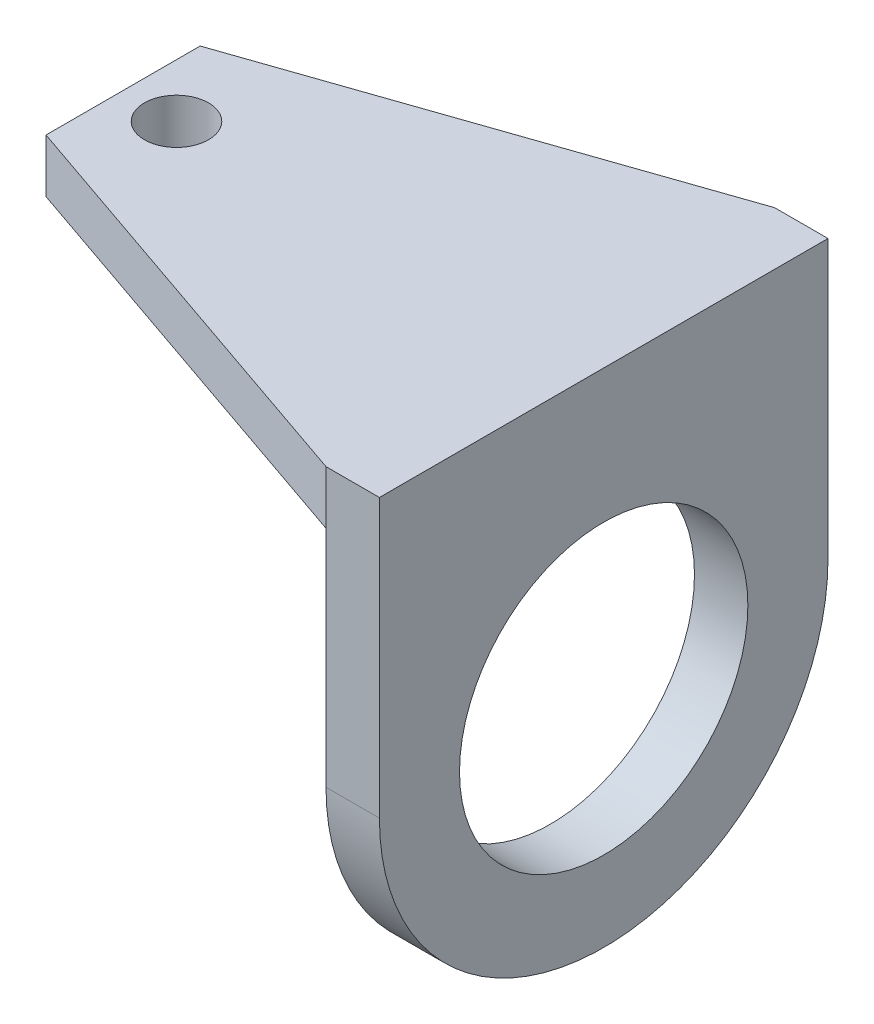
ISO-10303-21;
HEADER;
FILE_DESCRIPTION(('STEP AP214'),'2;1');
FILE_NAME('part.step','',(''),(''),'','','');
FILE_SCHEMA(('AUTOMOTIVE_DESIGN { 1 0 10303 214 1 1 1 1 }'));
ENDSEC;
DATA;
#1=APPLICATION_CONTEXT('core data for automotive mechanical design processes');
#2=APPLICATION_PROTOCOL_DEFINITION('international standard','automotive_design',2000,#1);
#3=PRODUCT_CONTEXT('',#1,'mechanical');
#4=PRODUCT('Part','Part','',(#3));
#5=PRODUCT_RELATED_PRODUCT_CATEGORY('part','',(#4));
#6=PRODUCT_DEFINITION_FORMATION('','',#4);
#7=PRODUCT_DEFINITION_CONTEXT('part definition',#1,'design');
#8=PRODUCT_DEFINITION('design','',#6,#7);
#9=PRODUCT_DEFINITION_SHAPE('','',#8);
#10=(LENGTH_UNIT() NAMED_UNIT(*) SI_UNIT(.MILLI.,.METRE.));
#11=(NAMED_UNIT(*) PLANE_ANGLE_UNIT() SI_UNIT($,.RADIAN.));
#12=(NAMED_UNIT(*) SI_UNIT($,.STERADIAN.) SOLID_ANGLE_UNIT());
#13=UNCERTAINTY_MEASURE_WITH_UNIT(LENGTH_MEASURE(1.E-05),#10,'distance_accuracy_value','');
#14=(GEOMETRIC_REPRESENTATION_CONTEXT(3) GLOBAL_UNCERTAINTY_ASSIGNED_CONTEXT((#13)) GLOBAL_UNIT_ASSIGNED_CONTEXT((#10,
#11,#12)) REPRESENTATION_CONTEXT('',''));
#15=CARTESIAN_POINT('',(0.,0.,0.));
#16=DIRECTION('',(0.,0.,1.));
#17=DIRECTION('',(1.,0.,0.));
#18=AXIS2_PLACEMENT_3D('',#15,#16,#17);
#19=CARTESIAN_POINT('',(0.,-21.001,21.));
#20=DIRECTION('',(0.,0.,-1.));
#21=DIRECTION('',(-1.,0.,0.));
#22=AXIS2_PLACEMENT_3D('',#19,#20,#21);
#23=PLANE('',#22);
#24=DIRECTION('',(0.,-1.,0.));
#25=VECTOR('',#24,1.);
#26=CARTESIAN_POINT('',(0.,26.,21.));
#27=LINE('',#26,#25);
#28=CARTESIAN_POINT('',(0.,26.,21.));
#29=VERTEX_POINT('',#28);
#30=CARTESIAN_POINT('',(0.,21.,21.));
#31=VERTEX_POINT('',#30);
#32=EDGE_CURVE('E50',#29,#31,#27,.T.);
#33=ORIENTED_EDGE('',*,*,#32,.T.);
#34=DIRECTION('',(0.,1.,0.));
#35=VECTOR('',#34,1.);
#36=CARTESIAN_POINT('',(0.,-21.001,21.));
#37=LINE('',#36,#35);
#38=CARTESIAN_POINT('',(0.,0.,21.));
#39=VERTEX_POINT('',#38);
#40=EDGE_CURVE('E150',#39,#31,#37,.T.);
#41=ORIENTED_EDGE('',*,*,#40,.F.);
#42=DIRECTION('',(-1.,0.,0.));
#43=VECTOR('',#42,1.);
#44=CARTESIAN_POINT('',(5.,0.,21.));
#45=LINE('',#44,#43);
#46=CARTESIAN_POINT('',(5.,0.,21.));
#47=VERTEX_POINT('',#46);
#48=EDGE_CURVE('E144',#39,#47,#45,.F.);
#49=ORIENTED_EDGE('',*,*,#48,.T.);
#50=DIRECTION('',(0.,1.,0.));
#51=VECTOR('',#50,1.);
#52=CARTESIAN_POINT('',(5.,-21.001,21.));
#53=LINE('',#52,#51);
#54=CARTESIAN_POINT('',(5.,26.,21.));
#55=VERTEX_POINT('',#54);
#56=EDGE_CURVE('E147',#47,#55,#53,.T.);
#57=ORIENTED_EDGE('',*,*,#56,.T.);
#58=DIRECTION('',(-1.,0.,0.));
#59=VECTOR('',#58,1.);
#60=CARTESIAN_POINT('',(0.,26.,21.));
#61=LINE('',#60,#59);
#62=EDGE_CURVE('E121',#55,#29,#61,.T.);
#63=ORIENTED_EDGE('',*,*,#62,.T.);
#64=EDGE_LOOP('',(#33,#41,#49,#57,#63));
#65=FACE_BOUND('',#64,.T.);
#66=ADVANCED_FACE('F35',(#65),#23,.F.);
#67=CARTESIAN_POINT('',(0.,-21.001,-21.));
#68=DIRECTION('',(0.,0.,1.));
#69=DIRECTION('',(1.,0.,0.));
#70=AXIS2_PLACEMENT_3D('',#67,#68,#69);
#71=PLANE('',#70);
#72=DIRECTION('',(0.,-1.,0.));
#73=VECTOR('',#72,1.);
#74=CARTESIAN_POINT('',(0.,26.,-21.));
#75=LINE('',#74,#73);
#76=CARTESIAN_POINT('',(0.,26.,-21.));
#77=VERTEX_POINT('',#76);
#78=CARTESIAN_POINT('',(0.,21.,-21.));
#79=VERTEX_POINT('',#78);
#80=EDGE_CURVE('E94',#77,#79,#75,.T.);
#81=ORIENTED_EDGE('',*,*,#80,.F.);
#82=DIRECTION('',(1.,0.,0.));
#83=VECTOR('',#82,1.);
#84=CARTESIAN_POINT('',(0.,26.,-21.));
#85=LINE('',#84,#83);
#86=CARTESIAN_POINT('',(5.,26.,-21.));
#87=VERTEX_POINT('',#86);
#88=EDGE_CURVE('E106',#77,#87,#85,.T.);
#89=ORIENTED_EDGE('',*,*,#88,.T.);
#90=DIRECTION('',(0.,1.,0.));
#91=VECTOR('',#90,1.);
#92=CARTESIAN_POINT('',(5.,-21.001,-21.));
#93=LINE('',#92,#91);
#94=CARTESIAN_POINT('',(5.,0.,-21.));
#95=VERTEX_POINT('',#94);
#96=EDGE_CURVE('E136',#95,#87,#93,.T.);
#97=ORIENTED_EDGE('',*,*,#96,.F.);
#98=DIRECTION('',(-1.,0.,0.));
#99=VECTOR('',#98,1.);
#100=CARTESIAN_POINT('',(5.,0.,-21.));
#101=LINE('',#100,#99);
#102=CARTESIAN_POINT('',(0.,0.,-21.));
#103=VERTEX_POINT('',#102);
#104=EDGE_CURVE('E141',#103,#95,#101,.F.);
#105=ORIENTED_EDGE('',*,*,#104,.F.);
#106=DIRECTION('',(0.,1.,0.));
#107=VECTOR('',#106,1.);
#108=CARTESIAN_POINT('',(0.,-21.001,-21.));
#109=LINE('',#108,#107);
#110=EDGE_CURVE('E110',#103,#79,#109,.T.);
#111=ORIENTED_EDGE('',*,*,#110,.T.);
#112=EDGE_LOOP('',(#81,#89,#97,#105,#111));
#113=FACE_BOUND('',#112,.T.);
#114=ADVANCED_FACE('F104',(#113),#71,.F.);
#115=CARTESIAN_POINT('',(0.,21.,0.));
#116=DIRECTION('',(0.,1.,0.));
#117=DIRECTION('',(0.,0.,1.));
#118=AXIS2_PLACEMENT_3D('',#115,#116,#117);
#119=PLANE('',#118);
#120=CARTESIAN_POINT('',(-35.,21.,0.));
#121=DIRECTION('',(0.,1.,0.));
#122=DIRECTION('',(0.,0.,1.));
#123=AXIS2_PLACEMENT_3D('',#120,#121,#122);
#124=CIRCLE('',#123,2.99999999999999);
#125=CARTESIAN_POINT('',(-35.,21.,2.99999999999999));
#126=VERTEX_POINT('',#125);
#127=EDGE_CURVE('E119',#126,#126,#124,.T.);
#128=ORIENTED_EDGE('',*,*,#127,.T.);
#129=EDGE_LOOP('',(#128));
#130=FACE_BOUND('',#129,.T.);
#131=DIRECTION('',(0.,0.,-1.));
#132=VECTOR('',#131,1.);
#133=CARTESIAN_POINT('',(-40.,21.,0.));
#134=LINE('',#133,#132);
#135=CARTESIAN_POINT('',(-40.,21.,7.21600945214453));
#136=VERTEX_POINT('',#135);
#137=CARTESIAN_POINT('',(-40.,21.,-7.21600945214452));
#138=VERTEX_POINT('',#137);
#139=EDGE_CURVE('E124',#136,#138,#134,.T.);
#140=ORIENTED_EDGE('',*,*,#139,.T.);
#141=DIRECTION('',(-0.945439342245588,0.,0.325798173927097));
#142=VECTOR('',#141,1.);
#143=CARTESIAN_POINT('',(-6.46847063651141,21.,-18.7709665471812));
#144=LINE('',#143,#142);
#145=EDGE_CURVE('E100',#79,#138,#144,.T.);
#146=ORIENTED_EDGE('',*,*,#145,.F.);
#147=DIRECTION('',(0.,0.,1.));
#148=VECTOR('',#147,1.);
#149=CARTESIAN_POINT('',(0.,21.,0.));
#150=LINE('',#149,#148);
#151=EDGE_CURVE('E143',#79,#31,#150,.T.);
#152=ORIENTED_EDGE('',*,*,#151,.T.);
#153=DIRECTION('',(-0.945439342245588,0.,-0.325798173927097));
#154=VECTOR('',#153,1.);
#155=CARTESIAN_POINT('',(-6.46847063651141,21.,18.7709665471812));
#156=LINE('',#155,#154);
#157=EDGE_CURVE('E295',#31,#136,#156,.T.);
#158=ORIENTED_EDGE('',*,*,#157,.T.);
#159=EDGE_LOOP('',(#140,#146,#152,#158));
#160=FACE_BOUND('',#159,.T.);
#161=ADVANCED_FACE('F183',(#130,#160),#119,.F.);
#162=CARTESIAN_POINT('',(-40.,26.,0.));
#163=DIRECTION('',(-1.,0.,0.));
#164=DIRECTION('',(0.,0.,1.));
#165=AXIS2_PLACEMENT_3D('',#162,#163,#164);
#166=PLANE('',#165);
#167=DIRECTION('',(0.,-1.,0.));
#168=VECTOR('',#167,1.);
#169=CARTESIAN_POINT('',(-40.,26.,-7.21600945214452));
#170=LINE('',#169,#168);
#171=CARTESIAN_POINT('',(-40.,26.,-7.21600945214452));
#172=VERTEX_POINT('',#171);
#173=EDGE_CURVE('E58',#172,#138,#170,.T.);
#174=ORIENTED_EDGE('',*,*,#173,.T.);
#175=ORIENTED_EDGE('',*,*,#139,.F.);
#176=DIRECTION('',(0.,-1.,0.));
#177=VECTOR('',#176,1.);
#178=CARTESIAN_POINT('',(-40.,26.,7.21600945214453));
#179=LINE('',#178,#177);
#180=CARTESIAN_POINT('',(-40.,26.,7.21600945214453));
#181=VERTEX_POINT('',#180);
#182=EDGE_CURVE('E127',#181,#136,#179,.T.);
#183=ORIENTED_EDGE('',*,*,#182,.F.);
#184=DIRECTION('',(0.,0.,-1.));
#185=VECTOR('',#184,1.);
#186=CARTESIAN_POINT('',(-40.,26.,0.));
#187=LINE('',#186,#185);
#188=EDGE_CURVE('E118',#181,#172,#187,.T.);
#189=ORIENTED_EDGE('',*,*,#188,.T.);
#190=EDGE_LOOP('',(#174,#175,#183,#189));
#191=FACE_BOUND('',#190,.T.);
#192=ADVANCED_FACE('F186',(#191),#166,.T.);
#193=CARTESIAN_POINT('',(0.,26.,0.));
#194=DIRECTION('',(0.,1.,0.));
#195=DIRECTION('',(0.,0.,1.));
#196=AXIS2_PLACEMENT_3D('',#193,#194,#195);
#197=PLANE('',#196);
#198=DIRECTION('',(-0.945439342245588,0.,0.325798173927097));
#199=VECTOR('',#198,1.);
#200=CARTESIAN_POINT('',(-6.46847063651141,26.,-18.7709665471812));
#201=LINE('',#200,#199);
#202=EDGE_CURVE('E91',#77,#172,#201,.T.);
#203=ORIENTED_EDGE('',*,*,#202,.T.);
#204=ORIENTED_EDGE('',*,*,#188,.F.);
#205=DIRECTION('',(-0.945439342245588,0.,-0.325798173927097));
#206=VECTOR('',#205,1.);
#207=CARTESIAN_POINT('',(-6.46847063651141,26.,18.7709665471812));
#208=LINE('',#207,#206);
#209=EDGE_CURVE('E300',#29,#181,#208,.T.);
#210=ORIENTED_EDGE('',*,*,#209,.F.);
#211=ORIENTED_EDGE('',*,*,#62,.F.);
#212=DIRECTION('',(0.,0.,-1.));
#213=VECTOR('',#212,1.);
#214=CARTESIAN_POINT('',(5.,26.,0.));
#215=LINE('',#214,#213);
#216=EDGE_CURVE('E117',#55,#87,#215,.T.);
#217=ORIENTED_EDGE('',*,*,#216,.T.);
#218=ORIENTED_EDGE('',*,*,#88,.F.);
#219=EDGE_LOOP('',(#203,#204,#210,#211,#217,#218));
#220=FACE_BOUND('',#219,.T.);
#221=CARTESIAN_POINT('',(-35.,26.,0.));
#222=DIRECTION('',(0.,1.,0.));
#223=DIRECTION('',(0.,0.,1.));
#224=AXIS2_PLACEMENT_3D('',#221,#222,#223);
#225=CIRCLE('',#224,2.99999999999999);
#226=CARTESIAN_POINT('',(-35.,26.,2.99999999999999));
#227=VERTEX_POINT('',#226);
#228=EDGE_CURVE('E133',#227,#227,#225,.T.);
#229=ORIENTED_EDGE('',*,*,#228,.F.);
#230=EDGE_LOOP('',(#229));
#231=FACE_BOUND('',#230,.T.);
#232=ADVANCED_FACE('F113',(#220,#231),#197,.T.);
#233=CARTESIAN_POINT('',(5.,0.,0.));
#234=DIRECTION('',(-1.,0.,0.));
#235=DIRECTION('',(0.,0.,1.));
#236=AXIS2_PLACEMENT_3D('',#233,#234,#235);
#237=CYLINDRICAL_SURFACE('',#236,21.);
#238=ORIENTED_EDGE('',*,*,#104,.T.);
#239=CARTESIAN_POINT('',(5.,0.,0.));
#240=DIRECTION('',(1.,0.,0.));
#241=DIRECTION('',(0.,0.,-1.));
#242=AXIS2_PLACEMENT_3D('',#239,#240,#241);
#243=CIRCLE('',#242,21.);
#244=EDGE_CURVE('E11',#47,#95,#243,.T.);
#245=ORIENTED_EDGE('',*,*,#244,.F.);
#246=ORIENTED_EDGE('',*,*,#48,.F.);
#247=CARTESIAN_POINT('',(0.,0.,0.));
#248=DIRECTION('',(1.,0.,0.));
#249=DIRECTION('',(0.,0.,-1.));
#250=AXIS2_PLACEMENT_3D('',#247,#248,#249);
#251=CIRCLE('',#250,21.);
#252=EDGE_CURVE('E39',#39,#103,#251,.T.);
#253=ORIENTED_EDGE('',*,*,#252,.T.);
#254=EDGE_LOOP('',(#238,#245,#246,#253));
#255=FACE_BOUND('',#254,.T.);
#256=ADVANCED_FACE('F37',(#255),#237,.T.);
#257=CARTESIAN_POINT('',(5.,0.,0.));
#258=DIRECTION('',(1.,0.,0.));
#259=DIRECTION('',(0.,0.,-1.));
#260=AXIS2_PLACEMENT_3D('',#257,#258,#259);
#261=PLANE('',#260);
#262=ORIENTED_EDGE('',*,*,#244,.T.);
#263=ORIENTED_EDGE('',*,*,#96,.T.);
#264=ORIENTED_EDGE('',*,*,#216,.F.);
#265=ORIENTED_EDGE('',*,*,#56,.F.);
#266=EDGE_LOOP('',(#262,#263,#264,#265));
#267=FACE_BOUND('',#266,.T.);
#268=CARTESIAN_POINT('',(5.,0.,0.));
#269=DIRECTION('',(1.,0.,0.));
#270=DIRECTION('',(0.,0.,-1.));
#271=AXIS2_PLACEMENT_3D('',#268,#269,#270);
#272=CIRCLE('',#271,13.5);
#273=CARTESIAN_POINT('',(5.,0.,-13.5));
#274=VERTEX_POINT('',#273);
#275=EDGE_CURVE('E154',#274,#274,#272,.T.);
#276=ORIENTED_EDGE('',*,*,#275,.F.);
#277=EDGE_LOOP('',(#276));
#278=FACE_BOUND('',#277,.T.);
#279=ADVANCED_FACE('F174',(#267,#278),#261,.T.);
#280=CARTESIAN_POINT('',(0.,0.,0.));
#281=DIRECTION('',(1.,0.,0.));
#282=DIRECTION('',(0.,0.,-1.));
#283=AXIS2_PLACEMENT_3D('',#280,#281,#282);
#284=PLANE('',#283);
#285=ORIENTED_EDGE('',*,*,#252,.F.);
#286=ORIENTED_EDGE('',*,*,#40,.T.);
#287=ORIENTED_EDGE('',*,*,#151,.F.);
#288=ORIENTED_EDGE('',*,*,#110,.F.);
#289=EDGE_LOOP('',(#285,#286,#287,#288));
#290=FACE_BOUND('',#289,.T.);
#291=CARTESIAN_POINT('',(0.,0.,0.));
#292=DIRECTION('',(1.,0.,0.));
#293=DIRECTION('',(0.,0.,-1.));
#294=AXIS2_PLACEMENT_3D('',#291,#292,#293);
#295=CIRCLE('',#294,13.5);
#296=CARTESIAN_POINT('',(0.,0.,-13.5));
#297=VERTEX_POINT('',#296);
#298=EDGE_CURVE('E146',#297,#297,#295,.T.);
#299=ORIENTED_EDGE('',*,*,#298,.T.);
#300=EDGE_LOOP('',(#299));
#301=FACE_BOUND('',#300,.T.);
#302=ADVANCED_FACE('F160',(#290,#301),#284,.F.);
#303=CARTESIAN_POINT('',(5.,0.,0.));
#304=DIRECTION('',(-1.,0.,0.));
#305=DIRECTION('',(0.,0.,1.));
#306=AXIS2_PLACEMENT_3D('',#303,#304,#305);
#307=CYLINDRICAL_SURFACE('',#306,13.5);
#308=ORIENTED_EDGE('',*,*,#275,.T.);
#309=EDGE_LOOP('',(#308));
#310=FACE_BOUND('',#309,.T.);
#311=ORIENTED_EDGE('',*,*,#298,.F.);
#312=EDGE_LOOP('',(#311));
#313=FACE_BOUND('',#312,.T.);
#314=ADVANCED_FACE('F162',(#310,#313),#307,.F.);
#315=CARTESIAN_POINT('',(-35.,26.,0.));
#316=DIRECTION('',(0.,-1.,0.));
#317=DIRECTION('',(0.,0.,-1.));
#318=AXIS2_PLACEMENT_3D('',#315,#316,#317);
#319=CYLINDRICAL_SURFACE('',#318,2.99999999999999);
#320=ORIENTED_EDGE('',*,*,#228,.T.);
#321=EDGE_LOOP('',(#320));
#322=FACE_BOUND('',#321,.T.);
#323=ORIENTED_EDGE('',*,*,#127,.F.);
#324=EDGE_LOOP('',(#323));
#325=FACE_BOUND('',#324,.T.);
#326=ADVANCED_FACE('F164',(#322,#325),#319,.F.);
#327=CARTESIAN_POINT('',(-6.46847063651141,26.,18.7709665471812));
#328=DIRECTION('',(-0.325798173927097,0.,0.945439342245587));
#329=DIRECTION('',(0.945439342245588,0.,0.325798173927097));
#330=AXIS2_PLACEMENT_3D('',#327,#328,#329);
#331=PLANE('',#330);
#332=ORIENTED_EDGE('',*,*,#157,.F.);
#333=ORIENTED_EDGE('',*,*,#32,.F.);
#334=ORIENTED_EDGE('',*,*,#209,.T.);
#335=ORIENTED_EDGE('',*,*,#182,.T.);
#336=EDGE_LOOP('',(#332,#333,#334,#335));
#337=FACE_BOUND('',#336,.T.);
#338=ADVANCED_FACE('F171',(#337),#331,.T.);
#339=CARTESIAN_POINT('',(-6.46847063651141,26.,-18.7709665471812));
#340=DIRECTION('',(0.325798173927097,0.,0.945439342245587));
#341=DIRECTION('',(0.945439342245588,0.,-0.325798173927097));
#342=AXIS2_PLACEMENT_3D('',#339,#340,#341);
#343=PLANE('',#342);
#344=ORIENTED_EDGE('',*,*,#145,.T.);
#345=ORIENTED_EDGE('',*,*,#173,.F.);
#346=ORIENTED_EDGE('',*,*,#202,.F.);
#347=ORIENTED_EDGE('',*,*,#80,.T.);
#348=EDGE_LOOP('',(#344,#345,#346,#347));
#349=FACE_BOUND('',#348,.T.);
#350=ADVANCED_FACE('F93',(#349),#343,.F.);
#351=CLOSED_SHELL('',(#66,#114,#161,#192,#232,#256,#279,#302,#314,#326,#338,#350));
#352=MANIFOLD_SOLID_BREP('B2',#351);
#353=ADVANCED_BREP_SHAPE_REPRESENTATION('',(#18,#352),#14);
#354=SHAPE_DEFINITION_REPRESENTATION(#9,#353);
ENDSEC;
END-ISO-10303-21;
